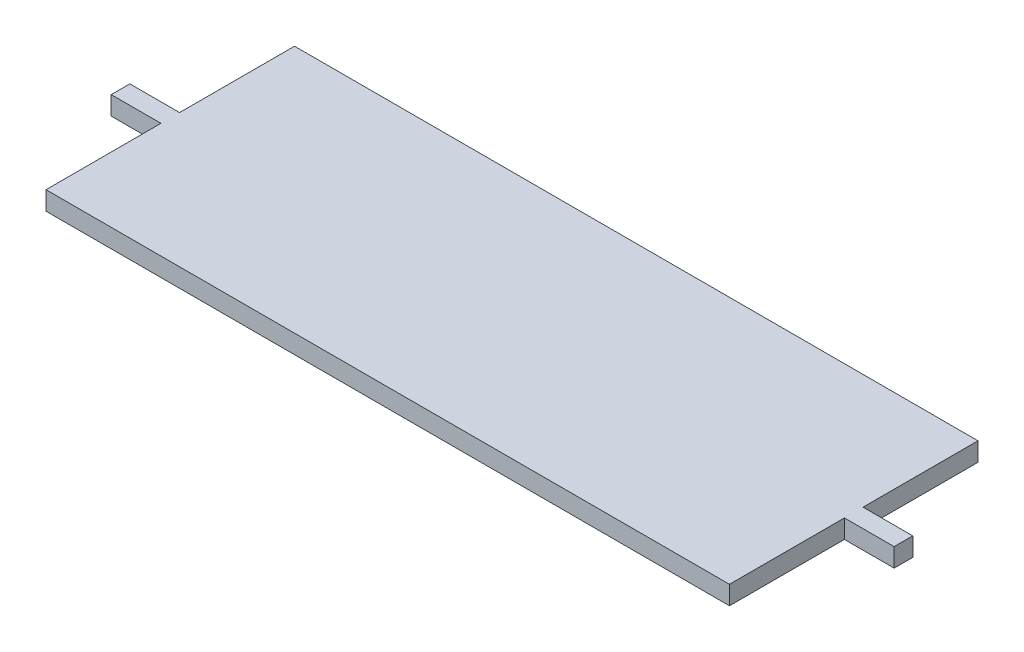
ISO-10303-21;
HEADER;
FILE_DESCRIPTION(('STEP AP214'),'2;1');
FILE_NAME('part.step','',(''),(''),'','','');
FILE_SCHEMA(('AUTOMOTIVE_DESIGN { 1 0 10303 214 1 1 1 1 }'));
ENDSEC;
DATA;
#1=APPLICATION_CONTEXT('core data for automotive mechanical design processes');
#2=APPLICATION_PROTOCOL_DEFINITION('international standard','automotive_design',2000,#1);
#3=PRODUCT_CONTEXT('',#1,'mechanical');
#4=PRODUCT('Part','Part','',(#3));
#5=PRODUCT_RELATED_PRODUCT_CATEGORY('part','',(#4));
#6=PRODUCT_DEFINITION_FORMATION('','',#4);
#7=PRODUCT_DEFINITION_CONTEXT('part definition',#1,'design');
#8=PRODUCT_DEFINITION('design','',#6,#7);
#9=PRODUCT_DEFINITION_SHAPE('','',#8);
#10=(LENGTH_UNIT() NAMED_UNIT(*) SI_UNIT(.MILLI.,.METRE.));
#11=(NAMED_UNIT(*) PLANE_ANGLE_UNIT() SI_UNIT($,.RADIAN.));
#12=(NAMED_UNIT(*) SI_UNIT($,.STERADIAN.) SOLID_ANGLE_UNIT());
#13=UNCERTAINTY_MEASURE_WITH_UNIT(LENGTH_MEASURE(1.E-05),#10,'distance_accuracy_value','');
#14=(GEOMETRIC_REPRESENTATION_CONTEXT(3) GLOBAL_UNCERTAINTY_ASSIGNED_CONTEXT((#13)) GLOBAL_UNIT_ASSIGNED_CONTEXT((#10,
#11,#12)) REPRESENTATION_CONTEXT('',''));
#15=CARTESIAN_POINT('',(0.,0.,0.));
#16=DIRECTION('',(0.,0.,1.));
#17=DIRECTION('',(1.,0.,0.));
#18=AXIS2_PLACEMENT_3D('',#15,#16,#17);
#19=CARTESIAN_POINT('',(118.,3.,0.));
#20=DIRECTION('',(1.,0.,0.));
#21=DIRECTION('',(0.,0.,-1.));
#22=AXIS2_PLACEMENT_3D('',#19,#20,#21);
#23=PLANE('',#22);
#24=DIRECTION('',(0.,0.,1.));
#25=VECTOR('',#24,1.);
#26=CARTESIAN_POINT('',(118.,0.,0.));
#27=LINE('',#26,#25);
#28=CARTESIAN_POINT('',(118.,0.,-21.5));
#29=VERTEX_POINT('',#28);
#30=CARTESIAN_POINT('',(118.,0.,-18.5));
#31=VERTEX_POINT('',#30);
#32=EDGE_CURVE('E164',#29,#31,#27,.T.);
#33=ORIENTED_EDGE('',*,*,#32,.F.);
#34=DIRECTION('',(0.,-1.,0.));
#35=VECTOR('',#34,1.);
#36=CARTESIAN_POINT('',(118.,3.,-21.5));
#37=LINE('',#36,#35);
#38=CARTESIAN_POINT('',(118.,3.,-21.5));
#39=VERTEX_POINT('',#38);
#40=EDGE_CURVE('E11',#39,#29,#37,.T.);
#41=ORIENTED_EDGE('',*,*,#40,.F.);
#42=DIRECTION('',(0.,0.,1.));
#43=VECTOR('',#42,1.);
#44=CARTESIAN_POINT('',(118.,3.,0.));
#45=LINE('',#44,#43);
#46=CARTESIAN_POINT('',(118.,3.,-18.5));
#47=VERTEX_POINT('',#46);
#48=EDGE_CURVE('E205',#39,#47,#45,.T.);
#49=ORIENTED_EDGE('',*,*,#48,.T.);
#50=DIRECTION('',(0.,-1.,0.));
#51=VECTOR('',#50,1.);
#52=CARTESIAN_POINT('',(118.,3.,-18.5));
#53=LINE('',#52,#51);
#54=EDGE_CURVE('E58',#47,#31,#53,.T.);
#55=ORIENTED_EDGE('',*,*,#54,.T.);
#56=EDGE_LOOP('',(#33,#41,#49,#55));
#57=FACE_BOUND('',#56,.T.);
#58=ADVANCED_FACE('F41',(#57),#23,.T.);
#59=CARTESIAN_POINT('',(0.,3.,-21.5));
#60=DIRECTION('',(0.,0.,-1.));
#61=DIRECTION('',(-1.,0.,0.));
#62=AXIS2_PLACEMENT_3D('',#59,#60,#61);
#63=PLANE('',#62);
#64=DIRECTION('',(1.,0.,0.));
#65=VECTOR('',#64,1.);
#66=CARTESIAN_POINT('',(0.,0.,-21.5));
#67=LINE('',#66,#65);
#68=CARTESIAN_POINT('',(110.,0.,-21.5));
#69=VERTEX_POINT('',#68);
#70=EDGE_CURVE('E167',#69,#29,#67,.T.);
#71=ORIENTED_EDGE('',*,*,#70,.F.);
#72=DIRECTION('',(0.,-1.,0.));
#73=VECTOR('',#72,1.);
#74=CARTESIAN_POINT('',(110.,3.,-21.5));
#75=LINE('',#74,#73);
#76=CARTESIAN_POINT('',(110.,3.,-21.5));
#77=VERTEX_POINT('',#76);
#78=EDGE_CURVE('E50',#77,#69,#75,.T.);
#79=ORIENTED_EDGE('',*,*,#78,.F.);
#80=DIRECTION('',(1.,0.,0.));
#81=VECTOR('',#80,1.);
#82=CARTESIAN_POINT('',(0.,3.,-21.5));
#83=LINE('',#82,#81);
#84=EDGE_CURVE('E247',#77,#39,#83,.T.);
#85=ORIENTED_EDGE('',*,*,#84,.T.);
#86=ORIENTED_EDGE('',*,*,#40,.T.);
#87=EDGE_LOOP('',(#71,#79,#85,#86));
#88=FACE_BOUND('',#87,.T.);
#89=ADVANCED_FACE('F246',(#88),#63,.T.);
#90=CARTESIAN_POINT('',(110.,3.,0.));
#91=DIRECTION('',(-1.,0.,0.));
#92=DIRECTION('',(0.,0.,1.));
#93=AXIS2_PLACEMENT_3D('',#90,#91,#92);
#94=PLANE('',#93);
#95=DIRECTION('',(0.,0.,-1.));
#96=VECTOR('',#95,1.);
#97=CARTESIAN_POINT('',(110.,0.,0.));
#98=LINE('',#97,#96);
#99=CARTESIAN_POINT('',(110.,0.,-40.));
#100=VERTEX_POINT('',#99);
#101=EDGE_CURVE('E171',#69,#100,#98,.T.);
#102=ORIENTED_EDGE('',*,*,#101,.T.);
#103=DIRECTION('',(0.,-1.,0.));
#104=VECTOR('',#103,1.);
#105=CARTESIAN_POINT('',(110.,3.,-40.));
#106=LINE('',#105,#104);
#107=CARTESIAN_POINT('',(110.,3.,-40.));
#108=VERTEX_POINT('',#107);
#109=EDGE_CURVE('E228',#108,#100,#106,.T.);
#110=ORIENTED_EDGE('',*,*,#109,.F.);
#111=DIRECTION('',(0.,0.,-1.));
#112=VECTOR('',#111,1.);
#113=CARTESIAN_POINT('',(110.,3.,0.));
#114=LINE('',#113,#112);
#115=EDGE_CURVE('E237',#77,#108,#114,.T.);
#116=ORIENTED_EDGE('',*,*,#115,.F.);
#117=ORIENTED_EDGE('',*,*,#78,.T.);
#118=EDGE_LOOP('',(#102,#110,#116,#117));
#119=FACE_BOUND('',#118,.T.);
#120=ADVANCED_FACE('F235',(#119),#94,.F.);
#121=CARTESIAN_POINT('',(0.,3.,-40.));
#122=DIRECTION('',(0.,0.,1.));
#123=DIRECTION('',(1.,0.,0.));
#124=AXIS2_PLACEMENT_3D('',#121,#122,#123);
#125=PLANE('',#124);
#126=DIRECTION('',(-1.,0.,0.));
#127=VECTOR('',#126,1.);
#128=CARTESIAN_POINT('',(0.,0.,-40.));
#129=LINE('',#128,#127);
#130=CARTESIAN_POINT('',(0.,0.,-40.));
#131=VERTEX_POINT('',#130);
#132=EDGE_CURVE('E174',#100,#131,#129,.T.);
#133=ORIENTED_EDGE('',*,*,#132,.T.);
#134=DIRECTION('',(0.,-1.,0.));
#135=VECTOR('',#134,1.);
#136=CARTESIAN_POINT('',(0.,3.,-40.));
#137=LINE('',#136,#135);
#138=CARTESIAN_POINT('',(0.,3.,-40.));
#139=VERTEX_POINT('',#138);
#140=EDGE_CURVE('E224',#139,#131,#137,.T.);
#141=ORIENTED_EDGE('',*,*,#140,.F.);
#142=DIRECTION('',(-1.,0.,0.));
#143=VECTOR('',#142,1.);
#144=CARTESIAN_POINT('',(0.,3.,-40.));
#145=LINE('',#144,#143);
#146=EDGE_CURVE('E420',#108,#139,#145,.T.);
#147=ORIENTED_EDGE('',*,*,#146,.F.);
#148=ORIENTED_EDGE('',*,*,#109,.T.);
#149=EDGE_LOOP('',(#133,#141,#147,#148));
#150=FACE_BOUND('',#149,.T.);
#151=ADVANCED_FACE('F265',(#150),#125,.F.);
#152=CARTESIAN_POINT('',(0.,3.,0.));
#153=DIRECTION('',(1.,0.,0.));
#154=DIRECTION('',(0.,0.,-1.));
#155=AXIS2_PLACEMENT_3D('',#152,#153,#154);
#156=PLANE('',#155);
#157=DIRECTION('',(0.,0.,1.));
#158=VECTOR('',#157,1.);
#159=CARTESIAN_POINT('',(0.,0.,0.));
#160=LINE('',#159,#158);
#161=CARTESIAN_POINT('',(0.,0.,-21.5));
#162=VERTEX_POINT('',#161);
#163=EDGE_CURVE('E177',#131,#162,#160,.T.);
#164=ORIENTED_EDGE('',*,*,#163,.T.);
#165=DIRECTION('',(0.,-1.,0.));
#166=VECTOR('',#165,1.);
#167=CARTESIAN_POINT('',(0.,3.,-21.5));
#168=LINE('',#167,#166);
#169=CARTESIAN_POINT('',(0.,3.,-21.5));
#170=VERTEX_POINT('',#169);
#171=EDGE_CURVE('E221',#170,#162,#168,.T.);
#172=ORIENTED_EDGE('',*,*,#171,.F.);
#173=DIRECTION('',(0.,0.,1.));
#174=VECTOR('',#173,1.);
#175=CARTESIAN_POINT('',(0.,3.,0.));
#176=LINE('',#175,#174);
#177=EDGE_CURVE('E418',#139,#170,#176,.T.);
#178=ORIENTED_EDGE('',*,*,#177,.F.);
#179=ORIENTED_EDGE('',*,*,#140,.T.);
#180=EDGE_LOOP('',(#164,#172,#178,#179));
#181=FACE_BOUND('',#180,.T.);
#182=ADVANCED_FACE('F270',(#181),#156,.F.);
#183=CARTESIAN_POINT('',(0.,3.,-21.5));
#184=DIRECTION('',(0.,0.,-1.));
#185=DIRECTION('',(-1.,0.,0.));
#186=AXIS2_PLACEMENT_3D('',#183,#184,#185);
#187=PLANE('',#186);
#188=DIRECTION('',(1.,0.,0.));
#189=VECTOR('',#188,1.);
#190=CARTESIAN_POINT('',(0.,0.,-21.5));
#191=LINE('',#190,#189);
#192=CARTESIAN_POINT('',(-8.,0.,-21.5));
#193=VERTEX_POINT('',#192);
#194=EDGE_CURVE('E181',#193,#162,#191,.T.);
#195=ORIENTED_EDGE('',*,*,#194,.F.);
#196=DIRECTION('',(0.,-1.,0.));
#197=VECTOR('',#196,1.);
#198=CARTESIAN_POINT('',(-8.,3.,-21.5));
#199=LINE('',#198,#197);
#200=CARTESIAN_POINT('',(-8.,3.,-21.5));
#201=VERTEX_POINT('',#200);
#202=EDGE_CURVE('E218',#201,#193,#199,.T.);
#203=ORIENTED_EDGE('',*,*,#202,.F.);
#204=DIRECTION('',(1.,0.,0.));
#205=VECTOR('',#204,1.);
#206=CARTESIAN_POINT('',(0.,3.,-21.5));
#207=LINE('',#206,#205);
#208=EDGE_CURVE('E415',#201,#170,#207,.T.);
#209=ORIENTED_EDGE('',*,*,#208,.T.);
#210=ORIENTED_EDGE('',*,*,#171,.T.);
#211=EDGE_LOOP('',(#195,#203,#209,#210));
#212=FACE_BOUND('',#211,.T.);
#213=ADVANCED_FACE('F274',(#212),#187,.T.);
#214=CARTESIAN_POINT('',(-8.,3.,0.));
#215=DIRECTION('',(-1.,0.,0.));
#216=DIRECTION('',(0.,0.,1.));
#217=AXIS2_PLACEMENT_3D('',#214,#215,#216);
#218=PLANE('',#217);
#219=DIRECTION('',(0.,0.,-1.));
#220=VECTOR('',#219,1.);
#221=CARTESIAN_POINT('',(-8.,0.,0.));
#222=LINE('',#221,#220);
#223=CARTESIAN_POINT('',(-8.,0.,-18.5));
#224=VERTEX_POINT('',#223);
#225=EDGE_CURVE('E185',#224,#193,#222,.T.);
#226=ORIENTED_EDGE('',*,*,#225,.F.);
#227=DIRECTION('',(0.,-1.,0.));
#228=VECTOR('',#227,1.);
#229=CARTESIAN_POINT('',(-8.,3.,-18.5));
#230=LINE('',#229,#228);
#231=CARTESIAN_POINT('',(-8.,3.,-18.5));
#232=VERTEX_POINT('',#231);
#233=EDGE_CURVE('E215',#232,#224,#230,.T.);
#234=ORIENTED_EDGE('',*,*,#233,.F.);
#235=DIRECTION('',(0.,0.,-1.));
#236=VECTOR('',#235,1.);
#237=CARTESIAN_POINT('',(-8.,3.,0.));
#238=LINE('',#237,#236);
#239=EDGE_CURVE('E431',#232,#201,#238,.T.);
#240=ORIENTED_EDGE('',*,*,#239,.T.);
#241=ORIENTED_EDGE('',*,*,#202,.T.);
#242=EDGE_LOOP('',(#226,#234,#240,#241));
#243=FACE_BOUND('',#242,.T.);
#244=ADVANCED_FACE('F278',(#243),#218,.T.);
#245=CARTESIAN_POINT('',(0.,3.,-18.5));
#246=DIRECTION('',(0.,0.,1.));
#247=DIRECTION('',(1.,0.,0.));
#248=AXIS2_PLACEMENT_3D('',#245,#246,#247);
#249=PLANE('',#248);
#250=DIRECTION('',(-1.,0.,0.));
#251=VECTOR('',#250,1.);
#252=CARTESIAN_POINT('',(0.,0.,-18.5));
#253=LINE('',#252,#251);
#254=CARTESIAN_POINT('',(0.,0.,-18.5));
#255=VERTEX_POINT('',#254);
#256=EDGE_CURVE('E189',#255,#224,#253,.T.);
#257=ORIENTED_EDGE('',*,*,#256,.F.);
#258=DIRECTION('',(0.,-1.,0.));
#259=VECTOR('',#258,1.);
#260=CARTESIAN_POINT('',(0.,3.,-18.5));
#261=LINE('',#260,#259);
#262=CARTESIAN_POINT('',(0.,3.,-18.5));
#263=VERTEX_POINT('',#262);
#264=EDGE_CURVE('E212',#263,#255,#261,.T.);
#265=ORIENTED_EDGE('',*,*,#264,.F.);
#266=DIRECTION('',(-1.,0.,0.));
#267=VECTOR('',#266,1.);
#268=CARTESIAN_POINT('',(0.,3.,-18.5));
#269=LINE('',#268,#267);
#270=EDGE_CURVE('E408',#263,#232,#269,.T.);
#271=ORIENTED_EDGE('',*,*,#270,.T.);
#272=ORIENTED_EDGE('',*,*,#233,.T.);
#273=EDGE_LOOP('',(#257,#265,#271,#272));
#274=FACE_BOUND('',#273,.T.);
#275=ADVANCED_FACE('F282',(#274),#249,.T.);
#276=CARTESIAN_POINT('',(0.,3.,0.));
#277=DIRECTION('',(1.,0.,0.));
#278=DIRECTION('',(0.,0.,-1.));
#279=AXIS2_PLACEMENT_3D('',#276,#277,#278);
#280=PLANE('',#279);
#281=DIRECTION('',(0.,0.,1.));
#282=VECTOR('',#281,1.);
#283=CARTESIAN_POINT('',(0.,0.,0.));
#284=LINE('',#283,#282);
#285=CARTESIAN_POINT('',(0.,0.,0.));
#286=VERTEX_POINT('',#285);
#287=EDGE_CURVE('E193',#255,#286,#284,.T.);
#288=ORIENTED_EDGE('',*,*,#287,.T.);
#289=DIRECTION('',(0.,-1.,0.));
#290=VECTOR('',#289,1.);
#291=CARTESIAN_POINT('',(0.,3.,0.));
#292=LINE('',#291,#290);
#293=CARTESIAN_POINT('',(0.,3.,0.));
#294=VERTEX_POINT('',#293);
#295=EDGE_CURVE('E154',#294,#286,#292,.T.);
#296=ORIENTED_EDGE('',*,*,#295,.F.);
#297=DIRECTION('',(0.,0.,1.));
#298=VECTOR('',#297,1.);
#299=CARTESIAN_POINT('',(0.,3.,0.));
#300=LINE('',#299,#298);
#301=EDGE_CURVE('E140',#263,#294,#300,.T.);
#302=ORIENTED_EDGE('',*,*,#301,.F.);
#303=ORIENTED_EDGE('',*,*,#264,.T.);
#304=EDGE_LOOP('',(#288,#296,#302,#303));
#305=FACE_BOUND('',#304,.T.);
#306=ADVANCED_FACE('F286',(#305),#280,.F.);
#307=CARTESIAN_POINT('',(0.,3.,0.));
#308=DIRECTION('',(0.,0.,-1.));
#309=DIRECTION('',(-1.,0.,0.));
#310=AXIS2_PLACEMENT_3D('',#307,#308,#309);
#311=PLANE('',#310);
#312=DIRECTION('',(1.,0.,0.));
#313=VECTOR('',#312,1.);
#314=CARTESIAN_POINT('',(0.,0.,0.));
#315=LINE('',#314,#313);
#316=CARTESIAN_POINT('',(110.,0.,0.));
#317=VERTEX_POINT('',#316);
#318=EDGE_CURVE('E150',#286,#317,#315,.T.);
#319=ORIENTED_EDGE('',*,*,#318,.T.);
#320=DIRECTION('',(0.,-1.,0.));
#321=VECTOR('',#320,1.);
#322=CARTESIAN_POINT('',(110.,3.,0.));
#323=LINE('',#322,#321);
#324=CARTESIAN_POINT('',(110.,3.,0.));
#325=VERTEX_POINT('',#324);
#326=EDGE_CURVE('E147',#325,#317,#323,.T.);
#327=ORIENTED_EDGE('',*,*,#326,.F.);
#328=DIRECTION('',(1.,0.,0.));
#329=VECTOR('',#328,1.);
#330=CARTESIAN_POINT('',(0.,3.,0.));
#331=LINE('',#330,#329);
#332=EDGE_CURVE('E132',#294,#325,#331,.T.);
#333=ORIENTED_EDGE('',*,*,#332,.F.);
#334=ORIENTED_EDGE('',*,*,#295,.T.);
#335=EDGE_LOOP('',(#319,#327,#333,#334));
#336=FACE_BOUND('',#335,.T.);
#337=ADVANCED_FACE('F148',(#336),#311,.F.);
#338=CARTESIAN_POINT('',(110.,3.,0.));
#339=DIRECTION('',(-1.,0.,0.));
#340=DIRECTION('',(0.,0.,1.));
#341=AXIS2_PLACEMENT_3D('',#338,#339,#340);
#342=PLANE('',#341);
#343=DIRECTION('',(0.,0.,-1.));
#344=VECTOR('',#343,1.);
#345=CARTESIAN_POINT('',(110.,0.,0.));
#346=LINE('',#345,#344);
#347=CARTESIAN_POINT('',(110.,0.,-18.5));
#348=VERTEX_POINT('',#347);
#349=EDGE_CURVE('E198',#317,#348,#346,.T.);
#350=ORIENTED_EDGE('',*,*,#349,.T.);
#351=DIRECTION('',(0.,-1.,0.));
#352=VECTOR('',#351,1.);
#353=CARTESIAN_POINT('',(110.,3.,-18.5));
#354=LINE('',#353,#352);
#355=CARTESIAN_POINT('',(110.,3.,-18.5));
#356=VERTEX_POINT('',#355);
#357=EDGE_CURVE('E96',#356,#348,#354,.T.);
#358=ORIENTED_EDGE('',*,*,#357,.F.);
#359=DIRECTION('',(0.,0.,-1.));
#360=VECTOR('',#359,1.);
#361=CARTESIAN_POINT('',(110.,3.,0.));
#362=LINE('',#361,#360);
#363=EDGE_CURVE('E137',#325,#356,#362,.T.);
#364=ORIENTED_EDGE('',*,*,#363,.F.);
#365=ORIENTED_EDGE('',*,*,#326,.T.);
#366=EDGE_LOOP('',(#350,#358,#364,#365));
#367=FACE_BOUND('',#366,.T.);
#368=ADVANCED_FACE('F156',(#367),#342,.F.);
#369=CARTESIAN_POINT('',(0.,3.,-18.5));
#370=DIRECTION('',(0.,0.,1.));
#371=DIRECTION('',(1.,0.,0.));
#372=AXIS2_PLACEMENT_3D('',#369,#370,#371);
#373=PLANE('',#372);
#374=DIRECTION('',(-1.,0.,0.));
#375=VECTOR('',#374,1.);
#376=CARTESIAN_POINT('',(0.,0.,-18.5));
#377=LINE('',#376,#375);
#378=EDGE_CURVE('E201',#31,#348,#377,.T.);
#379=ORIENTED_EDGE('',*,*,#378,.F.);
#380=ORIENTED_EDGE('',*,*,#54,.F.);
#381=DIRECTION('',(-1.,0.,0.));
#382=VECTOR('',#381,1.);
#383=CARTESIAN_POINT('',(0.,3.,-18.5));
#384=LINE('',#383,#382);
#385=EDGE_CURVE('E158',#47,#356,#384,.T.);
#386=ORIENTED_EDGE('',*,*,#385,.T.);
#387=ORIENTED_EDGE('',*,*,#357,.T.);
#388=EDGE_LOOP('',(#379,#380,#386,#387));
#389=FACE_BOUND('',#388,.T.);
#390=ADVANCED_FACE('F248',(#389),#373,.T.);
#391=CARTESIAN_POINT('',(0.,3.,0.));
#392=DIRECTION('',(0.,1.,0.));
#393=DIRECTION('',(0.,0.,1.));
#394=AXIS2_PLACEMENT_3D('',#391,#392,#393);
#395=PLANE('',#394);
#396=ORIENTED_EDGE('',*,*,#48,.F.);
#397=ORIENTED_EDGE('',*,*,#84,.F.);
#398=ORIENTED_EDGE('',*,*,#115,.T.);
#399=ORIENTED_EDGE('',*,*,#146,.T.);
#400=ORIENTED_EDGE('',*,*,#177,.T.);
#401=ORIENTED_EDGE('',*,*,#208,.F.);
#402=ORIENTED_EDGE('',*,*,#239,.F.);
#403=ORIENTED_EDGE('',*,*,#270,.F.);
#404=ORIENTED_EDGE('',*,*,#301,.T.);
#405=ORIENTED_EDGE('',*,*,#332,.T.);
#406=ORIENTED_EDGE('',*,*,#363,.T.);
#407=ORIENTED_EDGE('',*,*,#385,.F.);
#408=EDGE_LOOP('',(#396,#397,#398,#399,#400,#401,#402,#403,#404,#405,#406,#407));
#409=FACE_BOUND('',#408,.T.);
#410=ADVANCED_FACE('F134',(#409),#395,.T.);
#411=CARTESIAN_POINT('',(0.,0.,0.));
#412=DIRECTION('',(0.,1.,0.));
#413=DIRECTION('',(0.,0.,1.));
#414=AXIS2_PLACEMENT_3D('',#411,#412,#413);
#415=PLANE('',#414);
#416=ORIENTED_EDGE('',*,*,#32,.T.);
#417=ORIENTED_EDGE('',*,*,#378,.T.);
#418=ORIENTED_EDGE('',*,*,#349,.F.);
#419=ORIENTED_EDGE('',*,*,#318,.F.);
#420=ORIENTED_EDGE('',*,*,#287,.F.);
#421=ORIENTED_EDGE('',*,*,#256,.T.);
#422=ORIENTED_EDGE('',*,*,#225,.T.);
#423=ORIENTED_EDGE('',*,*,#194,.T.);
#424=ORIENTED_EDGE('',*,*,#163,.F.);
#425=ORIENTED_EDGE('',*,*,#132,.F.);
#426=ORIENTED_EDGE('',*,*,#101,.F.);
#427=ORIENTED_EDGE('',*,*,#70,.T.);
#428=EDGE_LOOP('',(#416,#417,#418,#419,#420,#421,#422,#423,#424,#425,#426,#427));
#429=FACE_BOUND('',#428,.T.);
#430=ADVANCED_FACE('F244',(#429),#415,.F.);
#431=CLOSED_SHELL('',(#58,#89,#120,#151,#182,#213,#244,#275,#306,#337,#368,#390,#410,#430));
#432=MANIFOLD_SOLID_BREP('B2',#431);
#433=ADVANCED_BREP_SHAPE_REPRESENTATION('',(#18,#432),#14);
#434=SHAPE_DEFINITION_REPRESENTATION(#9,#433);
ENDSEC;
END-ISO-10303-21;
